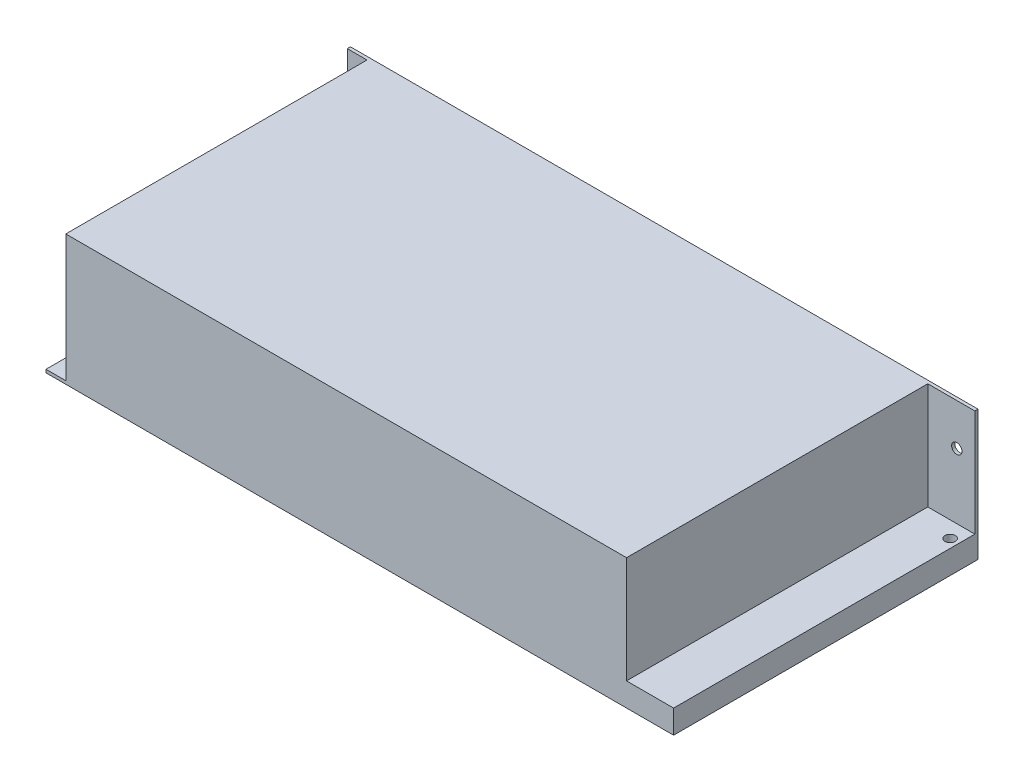
ISO-10303-21;
HEADER;
FILE_DESCRIPTION(('STEP AP214'),'2;1');
FILE_NAME('part.step','',(''),(''),'','','');
FILE_SCHEMA(('AUTOMOTIVE_DESIGN { 1 0 10303 214 1 1 1 1 }'));
ENDSEC;
DATA;
#1=APPLICATION_CONTEXT('core data for automotive mechanical design processes');
#2=APPLICATION_PROTOCOL_DEFINITION('international standard','automotive_design',2000,#1);
#3=PRODUCT_CONTEXT('',#1,'mechanical');
#4=PRODUCT('Part','Part','',(#3));
#5=PRODUCT_RELATED_PRODUCT_CATEGORY('part','',(#4));
#6=PRODUCT_DEFINITION_FORMATION('','',#4);
#7=PRODUCT_DEFINITION_CONTEXT('part definition',#1,'design');
#8=PRODUCT_DEFINITION('design','',#6,#7);
#9=PRODUCT_DEFINITION_SHAPE('','',#8);
#10=(LENGTH_UNIT() NAMED_UNIT(*) SI_UNIT(.MILLI.,.METRE.));
#11=(NAMED_UNIT(*) PLANE_ANGLE_UNIT() SI_UNIT($,.RADIAN.));
#12=(NAMED_UNIT(*) SI_UNIT($,.STERADIAN.) SOLID_ANGLE_UNIT());
#13=UNCERTAINTY_MEASURE_WITH_UNIT(LENGTH_MEASURE(1.E-05),#10,'distance_accuracy_value','');
#14=(GEOMETRIC_REPRESENTATION_CONTEXT(3) GLOBAL_UNCERTAINTY_ASSIGNED_CONTEXT((#13)) GLOBAL_UNIT_ASSIGNED_CONTEXT((#10,
#11,#12)) REPRESENTATION_CONTEXT('',''));
#15=CARTESIAN_POINT('',(0.,0.,0.));
#16=DIRECTION('',(0.,0.,1.));
#17=DIRECTION('',(1.,0.,0.));
#18=AXIS2_PLACEMENT_3D('',#15,#16,#17);
#19=CARTESIAN_POINT('',(-100.,20.75,48.5));
#20=DIRECTION('',(1.,0.,0.));
#21=DIRECTION('',(0.,0.,-1.));
#22=AXIS2_PLACEMENT_3D('',#19,#20,#21);
#23=PLANE('',#22);
#24=DIRECTION('',(0.,1.,0.));
#25=VECTOR('',#24,1.);
#26=CARTESIAN_POINT('',(-100.,-116.956496662128,-47.5));
#27=LINE('',#26,#25);
#28=CARTESIAN_POINT('',(-100.,-19.75,-47.5));
#29=VERTEX_POINT('',#28);
#30=CARTESIAN_POINT('',(-100.,5.95,-47.5));
#31=VERTEX_POINT('',#30);
#32=EDGE_CURVE('E238',#29,#31,#27,.T.);
#33=ORIENTED_EDGE('',*,*,#32,.T.);
#34=DIRECTION('',(0.,0.,1.));
#35=VECTOR('',#34,1.);
#36=CARTESIAN_POINT('',(-100.,5.95,-48.5));
#37=LINE('',#36,#35);
#38=CARTESIAN_POINT('',(-100.,5.95,-48.5));
#39=VERTEX_POINT('',#38);
#40=EDGE_CURVE('E217',#39,#31,#37,.T.);
#41=ORIENTED_EDGE('',*,*,#40,.F.);
#42=DIRECTION('',(0.,-1.,0.));
#43=VECTOR('',#42,1.);
#44=CARTESIAN_POINT('',(-100.,20.75,-48.5));
#45=LINE('',#44,#43);
#46=CARTESIAN_POINT('',(-100.,-20.75,-48.5));
#47=VERTEX_POINT('',#46);
#48=EDGE_CURVE('E322',#39,#47,#45,.T.);
#49=ORIENTED_EDGE('',*,*,#48,.T.);
#50=DIRECTION('',(0.,0.,1.));
#51=VECTOR('',#50,1.);
#52=CARTESIAN_POINT('',(-100.,-20.75,48.5));
#53=LINE('',#52,#51);
#54=CARTESIAN_POINT('',(-100.,-20.75,48.5));
#55=VERTEX_POINT('',#54);
#56=EDGE_CURVE('E310',#47,#55,#53,.T.);
#57=ORIENTED_EDGE('',*,*,#56,.T.);
#58=DIRECTION('',(0.,-1.,0.));
#59=VECTOR('',#58,1.);
#60=CARTESIAN_POINT('',(-100.,20.75,48.5));
#61=LINE('',#60,#59);
#62=CARTESIAN_POINT('',(-100.,-19.75,48.5));
#63=VERTEX_POINT('',#62);
#64=EDGE_CURVE('E319',#63,#55,#61,.T.);
#65=ORIENTED_EDGE('',*,*,#64,.F.);
#66=DIRECTION('',(0.,0.,1.));
#67=VECTOR('',#66,1.);
#68=CARTESIAN_POINT('',(-100.,-19.75,-47.5));
#69=LINE('',#68,#67);
#70=EDGE_CURVE('E234',#29,#63,#69,.T.);
#71=ORIENTED_EDGE('',*,*,#70,.F.);
#72=EDGE_LOOP('',(#33,#41,#49,#57,#65,#71));
#73=FACE_BOUND('',#72,.T.);
#74=ADVANCED_FACE('F45',(#73),#23,.F.);
#75=CARTESIAN_POINT('',(100.,20.75,48.5));
#76=DIRECTION('',(-1.,0.,0.));
#77=DIRECTION('',(0.,0.,1.));
#78=AXIS2_PLACEMENT_3D('',#75,#76,#77);
#79=PLANE('',#78);
#80=DIRECTION('',(0.,1.,0.));
#81=VECTOR('',#80,1.);
#82=CARTESIAN_POINT('',(100.,-117.91480844421,-47.5));
#83=LINE('',#82,#81);
#84=CARTESIAN_POINT('',(100.,-13.25,-47.5));
#85=VERTEX_POINT('',#84);
#86=CARTESIAN_POINT('',(100.,20.75,-47.5));
#87=VERTEX_POINT('',#86);
#88=EDGE_CURVE('E271',#85,#87,#83,.T.);
#89=ORIENTED_EDGE('',*,*,#88,.F.);
#90=DIRECTION('',(0.,0.,-1.));
#91=VECTOR('',#90,1.);
#92=CARTESIAN_POINT('',(100.,-13.25,48.5));
#93=LINE('',#92,#91);
#94=CARTESIAN_POINT('',(100.,-13.25,48.5));
#95=VERTEX_POINT('',#94);
#96=EDGE_CURVE('E267',#95,#85,#93,.T.);
#97=ORIENTED_EDGE('',*,*,#96,.F.);
#98=DIRECTION('',(0.,-1.,0.));
#99=VECTOR('',#98,1.);
#100=CARTESIAN_POINT('',(100.,20.75,48.5));
#101=LINE('',#100,#99);
#102=CARTESIAN_POINT('',(100.,-20.75,48.5));
#103=VERTEX_POINT('',#102);
#104=EDGE_CURVE('E302',#95,#103,#101,.T.);
#105=ORIENTED_EDGE('',*,*,#104,.T.);
#106=DIRECTION('',(0.,0.,-1.));
#107=VECTOR('',#106,1.);
#108=CARTESIAN_POINT('',(100.,-20.75,48.5));
#109=LINE('',#108,#107);
#110=CARTESIAN_POINT('',(100.,-20.75,-48.5));
#111=VERTEX_POINT('',#110);
#112=EDGE_CURVE('E288',#103,#111,#109,.T.);
#113=ORIENTED_EDGE('',*,*,#112,.T.);
#114=DIRECTION('',(0.,-1.,0.));
#115=VECTOR('',#114,1.);
#116=CARTESIAN_POINT('',(100.,20.75,-48.5));
#117=LINE('',#116,#115);
#118=CARTESIAN_POINT('',(100.,20.75,-48.5));
#119=VERTEX_POINT('',#118);
#120=EDGE_CURVE('E12',#119,#111,#117,.T.);
#121=ORIENTED_EDGE('',*,*,#120,.F.);
#122=DIRECTION('',(0.,0.,-1.));
#123=VECTOR('',#122,1.);
#124=CARTESIAN_POINT('',(100.,20.75,48.5));
#125=LINE('',#124,#123);
#126=EDGE_CURVE('E289',#87,#119,#125,.T.);
#127=ORIENTED_EDGE('',*,*,#126,.F.);
#128=EDGE_LOOP('',(#89,#97,#105,#113,#121,#127));
#129=FACE_BOUND('',#128,.T.);
#130=ADVANCED_FACE('F47',(#129),#79,.F.);
#131=CARTESIAN_POINT('',(-100.,20.75,-48.5));
#132=DIRECTION('',(0.,0.,1.));
#133=DIRECTION('',(1.,0.,0.));
#134=AXIS2_PLACEMENT_3D('',#131,#132,#133);
#135=PLANE('',#134);
#136=CARTESIAN_POINT('',(94.25,7.5,-48.5));
#137=DIRECTION('',(0.,0.,1.));
#138=DIRECTION('',(1.,0.,0.));
#139=AXIS2_PLACEMENT_3D('',#136,#137,#138);
#140=CIRCLE('',#139,1.65);
#141=CARTESIAN_POINT('',(95.9,7.5,-48.5));
#142=VERTEX_POINT('',#141);
#143=EDGE_CURVE('E229',#142,#142,#140,.T.);
#144=ORIENTED_EDGE('',*,*,#143,.T.);
#145=EDGE_LOOP('',(#144));
#146=FACE_BOUND('',#145,.T.);
#147=ORIENTED_EDGE('',*,*,#48,.F.);
#148=DIRECTION('',(1.,0.,0.));
#149=VECTOR('',#148,1.);
#150=CARTESIAN_POINT('',(-100.,5.95,-48.5));
#151=LINE('',#150,#149);
#152=CARTESIAN_POINT('',(-96.35,5.95,-48.5));
#153=VERTEX_POINT('',#152);
#154=EDGE_CURVE('E183',#39,#153,#151,.T.);
#155=ORIENTED_EDGE('',*,*,#154,.T.);
#156=CARTESIAN_POINT('',(-96.35,7.6,-48.5));
#157=DIRECTION('',(0.,0.,1.));
#158=DIRECTION('',(1.,0.,0.));
#159=AXIS2_PLACEMENT_3D('',#156,#157,#158);
#160=CIRCLE('',#159,1.65);
#161=CARTESIAN_POINT('',(-96.35,9.25,-48.5));
#162=VERTEX_POINT('',#161);
#163=EDGE_CURVE('E177',#153,#162,#160,.T.);
#164=ORIENTED_EDGE('',*,*,#163,.T.);
#165=DIRECTION('',(-1.,0.,0.));
#166=VECTOR('',#165,1.);
#167=CARTESIAN_POINT('',(-96.35,9.25,-48.5));
#168=LINE('',#167,#166);
#169=CARTESIAN_POINT('',(-100.,9.25,-48.5));
#170=VERTEX_POINT('',#169);
#171=EDGE_CURVE('E186',#162,#170,#168,.T.);
#172=ORIENTED_EDGE('',*,*,#171,.T.);
#173=CARTESIAN_POINT('',(-100.,20.75,-48.5));
#174=VERTEX_POINT('',#173);
#175=EDGE_CURVE('E55',#174,#170,#45,.T.);
#176=ORIENTED_EDGE('',*,*,#175,.F.);
#177=DIRECTION('',(-1.,0.,0.));
#178=VECTOR('',#177,1.);
#179=CARTESIAN_POINT('',(-100.,20.75,-48.5));
#180=LINE('',#179,#178);
#181=EDGE_CURVE('E292',#119,#174,#180,.T.);
#182=ORIENTED_EDGE('',*,*,#181,.F.);
#183=ORIENTED_EDGE('',*,*,#120,.T.);
#184=DIRECTION('',(-1.,0.,0.));
#185=VECTOR('',#184,1.);
#186=CARTESIAN_POINT('',(-100.,-20.75,-48.5));
#187=LINE('',#186,#185);
#188=EDGE_CURVE('E306',#111,#47,#187,.T.);
#189=ORIENTED_EDGE('',*,*,#188,.T.);
#190=EDGE_LOOP('',(#147,#155,#164,#172,#176,#182,#183,#189));
#191=FACE_BOUND('',#190,.T.);
#192=ADVANCED_FACE('F195',(#146,#191),#135,.F.);
#193=ORIENTED_EDGE('',*,*,#175,.T.);
#194=DIRECTION('',(0.,0.,1.));
#195=VECTOR('',#194,1.);
#196=CARTESIAN_POINT('',(-100.,9.25,-48.5));
#197=LINE('',#196,#195);
#198=CARTESIAN_POINT('',(-100.,9.25,-47.5));
#199=VERTEX_POINT('',#198);
#200=EDGE_CURVE('E182',#170,#199,#197,.T.);
#201=ORIENTED_EDGE('',*,*,#200,.T.);
#202=CARTESIAN_POINT('',(-100.,20.75,-47.5));
#203=VERTEX_POINT('',#202);
#204=EDGE_CURVE('E243',#199,#203,#27,.T.);
#205=ORIENTED_EDGE('',*,*,#204,.T.);
#206=DIRECTION('',(0.,0.,1.));
#207=VECTOR('',#206,1.);
#208=CARTESIAN_POINT('',(-100.,20.75,48.5));
#209=LINE('',#208,#207);
#210=EDGE_CURVE('E296',#174,#203,#209,.T.);
#211=ORIENTED_EDGE('',*,*,#210,.F.);
#212=EDGE_LOOP('',(#193,#201,#205,#211));
#213=FACE_BOUND('',#212,.T.);
#214=ADVANCED_FACE('F373',(#213),#23,.F.);
#215=CARTESIAN_POINT('',(-100.,20.75,48.5));
#216=DIRECTION('',(0.,0.,-1.));
#217=DIRECTION('',(-1.,0.,0.));
#218=AXIS2_PLACEMENT_3D('',#215,#216,#217);
#219=PLANE('',#218);
#220=DIRECTION('',(0.,1.,0.));
#221=VECTOR('',#220,1.);
#222=CARTESIAN_POINT('',(-93.6999999999999,-116.956496662128,48.5));
#223=LINE('',#222,#221);
#224=CARTESIAN_POINT('',(-93.6999999999999,-19.75,48.5));
#225=VERTEX_POINT('',#224);
#226=CARTESIAN_POINT('',(-93.6999999999999,20.75,48.5));
#227=VERTEX_POINT('',#226);
#228=EDGE_CURVE('E233',#225,#227,#223,.T.);
#229=ORIENTED_EDGE('',*,*,#228,.F.);
#230=DIRECTION('',(1.,0.,0.));
#231=VECTOR('',#230,1.);
#232=CARTESIAN_POINT('',(-100.,-19.75,48.5));
#233=LINE('',#232,#231);
#234=EDGE_CURVE('E226',#63,#225,#233,.T.);
#235=ORIENTED_EDGE('',*,*,#234,.F.);
#236=ORIENTED_EDGE('',*,*,#64,.T.);
#237=DIRECTION('',(1.,0.,0.));
#238=VECTOR('',#237,1.);
#239=CARTESIAN_POINT('',(-100.,-20.75,48.5));
#240=LINE('',#239,#238);
#241=EDGE_CURVE('E293',#55,#103,#240,.T.);
#242=ORIENTED_EDGE('',*,*,#241,.T.);
#243=ORIENTED_EDGE('',*,*,#104,.F.);
#244=DIRECTION('',(1.,0.,0.));
#245=VECTOR('',#244,1.);
#246=CARTESIAN_POINT('',(100.,-13.25,48.5));
#247=LINE('',#246,#245);
#248=CARTESIAN_POINT('',(85.,-13.25,48.5));
#249=VERTEX_POINT('',#248);
#250=EDGE_CURVE('E272',#249,#95,#247,.T.);
#251=ORIENTED_EDGE('',*,*,#250,.F.);
#252=DIRECTION('',(0.,1.,0.));
#253=VECTOR('',#252,1.);
#254=CARTESIAN_POINT('',(85.,-117.91480844421,48.5));
#255=LINE('',#254,#253);
#256=CARTESIAN_POINT('',(85.,20.75,48.5));
#257=VERTEX_POINT('',#256);
#258=EDGE_CURVE('E275',#249,#257,#255,.T.);
#259=ORIENTED_EDGE('',*,*,#258,.T.);
#260=DIRECTION('',(1.,0.,0.));
#261=VECTOR('',#260,1.);
#262=CARTESIAN_POINT('',(-100.,20.75,48.5));
#263=LINE('',#262,#261);
#264=EDGE_CURVE('E299',#227,#257,#263,.T.);
#265=ORIENTED_EDGE('',*,*,#264,.F.);
#266=EDGE_LOOP('',(#229,#235,#236,#242,#243,#251,#259,#265));
#267=FACE_BOUND('',#266,.T.);
#268=ADVANCED_FACE('F341',(#267),#219,.F.);
#269=CARTESIAN_POINT('',(0.,20.75,0.));
#270=DIRECTION('',(0.,-1.,0.));
#271=DIRECTION('',(0.,0.,-1.));
#272=AXIS2_PLACEMENT_3D('',#269,#270,#271);
#273=PLANE('',#272);
#274=DIRECTION('',(-1.,0.,0.));
#275=VECTOR('',#274,1.);
#276=CARTESIAN_POINT('',(-100.,20.75,-47.5));
#277=LINE('',#276,#275);
#278=CARTESIAN_POINT('',(-93.7,20.75,-47.5));
#279=VERTEX_POINT('',#278);
#280=EDGE_CURVE('E222',#279,#203,#277,.T.);
#281=ORIENTED_EDGE('',*,*,#280,.F.);
#282=DIRECTION('',(0.,0.,-1.));
#283=VECTOR('',#282,1.);
#284=CARTESIAN_POINT('',(-93.7,20.75,-47.5));
#285=LINE('',#284,#283);
#286=EDGE_CURVE('E76',#227,#279,#285,.T.);
#287=ORIENTED_EDGE('',*,*,#286,.F.);
#288=ORIENTED_EDGE('',*,*,#264,.T.);
#289=DIRECTION('',(0.,0.,1.));
#290=VECTOR('',#289,1.);
#291=CARTESIAN_POINT('',(85.,20.75,48.5));
#292=LINE('',#291,#290);
#293=CARTESIAN_POINT('',(85.,20.75,-47.5));
#294=VERTEX_POINT('',#293);
#295=EDGE_CURVE('E256',#294,#257,#292,.T.);
#296=ORIENTED_EDGE('',*,*,#295,.F.);
#297=DIRECTION('',(-1.,0.,0.));
#298=VECTOR('',#297,1.);
#299=CARTESIAN_POINT('',(100.,20.75,-47.5));
#300=LINE('',#299,#298);
#301=EDGE_CURVE('E237',#87,#294,#300,.T.);
#302=ORIENTED_EDGE('',*,*,#301,.F.);
#303=ORIENTED_EDGE('',*,*,#126,.T.);
#304=ORIENTED_EDGE('',*,*,#181,.T.);
#305=ORIENTED_EDGE('',*,*,#210,.T.);
#306=EDGE_LOOP('',(#281,#287,#288,#296,#302,#303,#304,#305));
#307=FACE_BOUND('',#306,.T.);
#308=ADVANCED_FACE('F354',(#307),#273,.F.);
#309=CARTESIAN_POINT('',(0.,-20.75,0.));
#310=DIRECTION('',(0.,-1.,0.));
#311=DIRECTION('',(0.,0.,-1.));
#312=AXIS2_PLACEMENT_3D('',#309,#310,#311);
#313=PLANE('',#312);
#314=CARTESIAN_POINT('',(97.25,-20.75,-42.35));
#315=DIRECTION('',(0.,-1.,0.));
#316=DIRECTION('',(0.,0.,-1.));
#317=AXIS2_PLACEMENT_3D('',#314,#315,#316);
#318=CIRCLE('',#317,1.65);
#319=CARTESIAN_POINT('',(97.25,-20.75,-44.));
#320=VERTEX_POINT('',#319);
#321=EDGE_CURVE('E426',#320,#320,#318,.T.);
#322=ORIENTED_EDGE('',*,*,#321,.F.);
#323=EDGE_LOOP('',(#322));
#324=FACE_BOUND('',#323,.T.);
#325=ORIENTED_EDGE('',*,*,#112,.F.);
#326=ORIENTED_EDGE('',*,*,#241,.F.);
#327=ORIENTED_EDGE('',*,*,#56,.F.);
#328=ORIENTED_EDGE('',*,*,#188,.F.);
#329=EDGE_LOOP('',(#325,#326,#327,#328));
#330=FACE_BOUND('',#329,.T.);
#331=ADVANCED_FACE('F337',(#324,#330),#313,.T.);
#332=CARTESIAN_POINT('',(0.,-13.25,0.));
#333=DIRECTION('',(0.,-1.,0.));
#334=DIRECTION('',(0.,0.,-1.));
#335=AXIS2_PLACEMENT_3D('',#332,#333,#334);
#336=PLANE('',#335);
#337=CARTESIAN_POINT('',(97.25,-13.25,-42.35));
#338=DIRECTION('',(0.,-1.,0.));
#339=DIRECTION('',(0.,0.,-1.));
#340=AXIS2_PLACEMENT_3D('',#337,#338,#339);
#341=CIRCLE('',#340,1.65);
#342=CARTESIAN_POINT('',(97.25,-13.25,-44.));
#343=VERTEX_POINT('',#342);
#344=EDGE_CURVE('E49',#343,#343,#341,.T.);
#345=ORIENTED_EDGE('',*,*,#344,.T.);
#346=EDGE_LOOP('',(#345));
#347=FACE_BOUND('',#346,.T.);
#348=ORIENTED_EDGE('',*,*,#96,.T.);
#349=DIRECTION('',(-1.,0.,0.));
#350=VECTOR('',#349,1.);
#351=CARTESIAN_POINT('',(100.,-13.25,-47.5));
#352=LINE('',#351,#350);
#353=CARTESIAN_POINT('',(85.,-13.25,-47.5));
#354=VERTEX_POINT('',#353);
#355=EDGE_CURVE('E260',#85,#354,#352,.T.);
#356=ORIENTED_EDGE('',*,*,#355,.T.);
#357=DIRECTION('',(0.,0.,1.));
#358=VECTOR('',#357,1.);
#359=CARTESIAN_POINT('',(85.,-13.25,48.5));
#360=LINE('',#359,#358);
#361=EDGE_CURVE('E276',#354,#249,#360,.T.);
#362=ORIENTED_EDGE('',*,*,#361,.T.);
#363=ORIENTED_EDGE('',*,*,#250,.T.);
#364=EDGE_LOOP('',(#348,#356,#362,#363));
#365=FACE_BOUND('',#364,.T.);
#366=ADVANCED_FACE('F360',(#347,#365),#336,.F.);
#367=CARTESIAN_POINT('',(100.,-117.91480844421,-47.5));
#368=DIRECTION('',(0.,0.,-1.));
#369=DIRECTION('',(-1.,0.,0.));
#370=AXIS2_PLACEMENT_3D('',#367,#368,#369);
#371=PLANE('',#370);
#372=CARTESIAN_POINT('',(94.25,7.5,-47.5));
#373=DIRECTION('',(0.,0.,1.));
#374=DIRECTION('',(1.,0.,0.));
#375=AXIS2_PLACEMENT_3D('',#372,#373,#374);
#376=CIRCLE('',#375,1.65);
#377=CARTESIAN_POINT('',(95.9,7.5,-47.5));
#378=VERTEX_POINT('',#377);
#379=EDGE_CURVE('E205',#378,#378,#376,.T.);
#380=ORIENTED_EDGE('',*,*,#379,.F.);
#381=EDGE_LOOP('',(#380));
#382=FACE_BOUND('',#381,.T.);
#383=ORIENTED_EDGE('',*,*,#88,.T.);
#384=ORIENTED_EDGE('',*,*,#301,.T.);
#385=DIRECTION('',(0.,1.,0.));
#386=VECTOR('',#385,1.);
#387=CARTESIAN_POINT('',(85.,-117.91480844421,-47.5));
#388=LINE('',#387,#386);
#389=EDGE_CURVE('E266',#354,#294,#388,.T.);
#390=ORIENTED_EDGE('',*,*,#389,.F.);
#391=ORIENTED_EDGE('',*,*,#355,.F.);
#392=EDGE_LOOP('',(#383,#384,#390,#391));
#393=FACE_BOUND('',#392,.T.);
#394=ADVANCED_FACE('F364',(#382,#393),#371,.F.);
#395=CARTESIAN_POINT('',(85.,-117.91480844421,48.5));
#396=DIRECTION('',(-1.,0.,0.));
#397=DIRECTION('',(0.,0.,1.));
#398=AXIS2_PLACEMENT_3D('',#395,#396,#397);
#399=PLANE('',#398);
#400=ORIENTED_EDGE('',*,*,#389,.T.);
#401=ORIENTED_EDGE('',*,*,#295,.T.);
#402=ORIENTED_EDGE('',*,*,#258,.F.);
#403=ORIENTED_EDGE('',*,*,#361,.F.);
#404=EDGE_LOOP('',(#400,#401,#402,#403));
#405=FACE_BOUND('',#404,.T.);
#406=ADVANCED_FACE('F357',(#405),#399,.F.);
#407=CARTESIAN_POINT('',(0.,-19.75,0.));
#408=DIRECTION('',(0.,-1.,0.));
#409=DIRECTION('',(0.,0.,-1.));
#410=AXIS2_PLACEMENT_3D('',#407,#408,#409);
#411=PLANE('',#410);
#412=ORIENTED_EDGE('',*,*,#70,.T.);
#413=ORIENTED_EDGE('',*,*,#234,.T.);
#414=DIRECTION('',(0.,0.,-1.));
#415=VECTOR('',#414,1.);
#416=CARTESIAN_POINT('',(-93.7,-19.75,-47.5));
#417=LINE('',#416,#415);
#418=CARTESIAN_POINT('',(-93.7,-19.75,-47.5));
#419=VERTEX_POINT('',#418);
#420=EDGE_CURVE('E245',#225,#419,#417,.T.);
#421=ORIENTED_EDGE('',*,*,#420,.T.);
#422=DIRECTION('',(-1.,0.,0.));
#423=VECTOR('',#422,1.);
#424=CARTESIAN_POINT('',(-100.,-19.75,-47.5));
#425=LINE('',#424,#423);
#426=EDGE_CURVE('E239',#419,#29,#425,.T.);
#427=ORIENTED_EDGE('',*,*,#426,.T.);
#428=EDGE_LOOP('',(#412,#413,#421,#427));
#429=FACE_BOUND('',#428,.T.);
#430=ADVANCED_FACE('F346',(#429),#411,.F.);
#431=CARTESIAN_POINT('',(-93.7,-116.956496662128,-47.5));
#432=DIRECTION('',(1.,0.,0.));
#433=DIRECTION('',(0.,0.,-1.));
#434=AXIS2_PLACEMENT_3D('',#431,#432,#433);
#435=PLANE('',#434);
#436=ORIENTED_EDGE('',*,*,#228,.T.);
#437=ORIENTED_EDGE('',*,*,#286,.T.);
#438=DIRECTION('',(0.,1.,0.));
#439=VECTOR('',#438,1.);
#440=CARTESIAN_POINT('',(-93.7,-116.956496662128,-47.5));
#441=LINE('',#440,#439);
#442=EDGE_CURVE('E244',#419,#279,#441,.T.);
#443=ORIENTED_EDGE('',*,*,#442,.F.);
#444=ORIENTED_EDGE('',*,*,#420,.F.);
#445=EDGE_LOOP('',(#436,#437,#443,#444));
#446=FACE_BOUND('',#445,.T.);
#447=ADVANCED_FACE('F351',(#446),#435,.F.);
#448=CARTESIAN_POINT('',(-100.,-116.956496662128,-47.5));
#449=DIRECTION('',(0.,0.,-1.));
#450=DIRECTION('',(-1.,0.,0.));
#451=AXIS2_PLACEMENT_3D('',#448,#449,#450);
#452=PLANE('',#451);
#453=CARTESIAN_POINT('',(-96.35,7.6,-47.5));
#454=DIRECTION('',(0.,0.,1.));
#455=DIRECTION('',(1.,0.,0.));
#456=AXIS2_PLACEMENT_3D('',#453,#454,#455);
#457=CIRCLE('',#456,1.65);
#458=CARTESIAN_POINT('',(-96.35,5.95,-47.5));
#459=VERTEX_POINT('',#458);
#460=CARTESIAN_POINT('',(-96.35,9.24999999999999,-47.5));
#461=VERTEX_POINT('',#460);
#462=EDGE_CURVE('E65',#459,#461,#457,.T.);
#463=ORIENTED_EDGE('',*,*,#462,.F.);
#464=DIRECTION('',(1.,0.,0.));
#465=VECTOR('',#464,1.);
#466=CARTESIAN_POINT('',(-100.,5.95,-47.5));
#467=LINE('',#466,#465);
#468=EDGE_CURVE('E197',#31,#459,#467,.T.);
#469=ORIENTED_EDGE('',*,*,#468,.F.);
#470=ORIENTED_EDGE('',*,*,#32,.F.);
#471=ORIENTED_EDGE('',*,*,#426,.F.);
#472=ORIENTED_EDGE('',*,*,#442,.T.);
#473=ORIENTED_EDGE('',*,*,#280,.T.);
#474=ORIENTED_EDGE('',*,*,#204,.F.);
#475=DIRECTION('',(-1.,0.,0.));
#476=VECTOR('',#475,1.);
#477=CARTESIAN_POINT('',(-96.35,9.25,-47.5));
#478=LINE('',#477,#476);
#479=EDGE_CURVE('E202',#461,#199,#478,.T.);
#480=ORIENTED_EDGE('',*,*,#479,.F.);
#481=EDGE_LOOP('',(#463,#469,#470,#471,#472,#473,#474,#480));
#482=FACE_BOUND('',#481,.T.);
#483=ADVANCED_FACE('F348',(#482),#452,.F.);
#484=CARTESIAN_POINT('',(-96.35,7.6,-48.5));
#485=DIRECTION('',(0.,0.,1.));
#486=DIRECTION('',(1.,0.,0.));
#487=AXIS2_PLACEMENT_3D('',#484,#485,#486);
#488=CYLINDRICAL_SURFACE('',#487,1.65);
#489=ORIENTED_EDGE('',*,*,#462,.T.);
#490=DIRECTION('',(0.,0.,1.));
#491=VECTOR('',#490,1.);
#492=CARTESIAN_POINT('',(-96.35,9.25,-48.5));
#493=LINE('',#492,#491);
#494=EDGE_CURVE('E173',#162,#461,#493,.T.);
#495=ORIENTED_EDGE('',*,*,#494,.F.);
#496=ORIENTED_EDGE('',*,*,#163,.F.);
#497=DIRECTION('',(0.,0.,1.));
#498=VECTOR('',#497,1.);
#499=CARTESIAN_POINT('',(-96.35,5.95,-48.5));
#500=LINE('',#499,#498);
#501=EDGE_CURVE('E214',#153,#459,#500,.T.);
#502=ORIENTED_EDGE('',*,*,#501,.T.);
#503=EDGE_LOOP('',(#489,#495,#496,#502));
#504=FACE_BOUND('',#503,.T.);
#505=ADVANCED_FACE('F175',(#504),#488,.F.);
#506=CARTESIAN_POINT('',(-100.,5.95,-48.5));
#507=DIRECTION('',(0.,-1.,0.));
#508=DIRECTION('',(1.,0.,0.));
#509=AXIS2_PLACEMENT_3D('',#506,#507,#508);
#510=PLANE('',#509);
#511=ORIENTED_EDGE('',*,*,#468,.T.);
#512=ORIENTED_EDGE('',*,*,#501,.F.);
#513=ORIENTED_EDGE('',*,*,#154,.F.);
#514=ORIENTED_EDGE('',*,*,#40,.T.);
#515=EDGE_LOOP('',(#511,#512,#513,#514));
#516=FACE_BOUND('',#515,.T.);
#517=ADVANCED_FACE('F409',(#516),#510,.F.);
#518=CARTESIAN_POINT('',(-96.35,9.25,-48.5));
#519=DIRECTION('',(0.,1.,0.));
#520=DIRECTION('',(0.,0.,1.));
#521=AXIS2_PLACEMENT_3D('',#518,#519,#520);
#522=PLANE('',#521);
#523=ORIENTED_EDGE('',*,*,#479,.T.);
#524=ORIENTED_EDGE('',*,*,#200,.F.);
#525=ORIENTED_EDGE('',*,*,#171,.F.);
#526=ORIENTED_EDGE('',*,*,#494,.T.);
#527=EDGE_LOOP('',(#523,#524,#525,#526));
#528=FACE_BOUND('',#527,.T.);
#529=ADVANCED_FACE('F187',(#528),#522,.F.);
#530=CARTESIAN_POINT('',(94.25,7.5,-48.5));
#531=DIRECTION('',(0.,0.,1.));
#532=DIRECTION('',(1.,0.,0.));
#533=AXIS2_PLACEMENT_3D('',#530,#531,#532);
#534=CYLINDRICAL_SURFACE('',#533,1.65);
#535=ORIENTED_EDGE('',*,*,#143,.F.);
#536=EDGE_LOOP('',(#535));
#537=FACE_BOUND('',#536,.T.);
#538=ORIENTED_EDGE('',*,*,#379,.T.);
#539=EDGE_LOOP('',(#538));
#540=FACE_BOUND('',#539,.T.);
#541=ADVANCED_FACE('F412',(#537,#540),#534,.F.);
#542=CARTESIAN_POINT('',(97.25,20.75,-42.35));
#543=DIRECTION('',(0.,-1.,0.));
#544=DIRECTION('',(0.,0.,-1.));
#545=AXIS2_PLACEMENT_3D('',#542,#543,#544);
#546=CYLINDRICAL_SURFACE('',#545,1.65);
#547=ORIENTED_EDGE('',*,*,#321,.T.);
#548=EDGE_LOOP('',(#547));
#549=FACE_BOUND('',#548,.T.);
#550=ORIENTED_EDGE('',*,*,#344,.F.);
#551=EDGE_LOOP('',(#550));
#552=FACE_BOUND('',#551,.T.);
#553=ADVANCED_FACE('F418',(#549,#552),#546,.F.);
#554=CLOSED_SHELL('',(#74,#130,#192,#214,#268,#308,#331,#366,#394,#406,#430,#447,#483,#505,#517,
#529,#541,#553));
#555=MANIFOLD_SOLID_BREP('B2',#554);
#556=ADVANCED_BREP_SHAPE_REPRESENTATION('',(#18,#555),#14);
#557=SHAPE_DEFINITION_REPRESENTATION(#9,#556);
ENDSEC;
END-ISO-10303-21;
